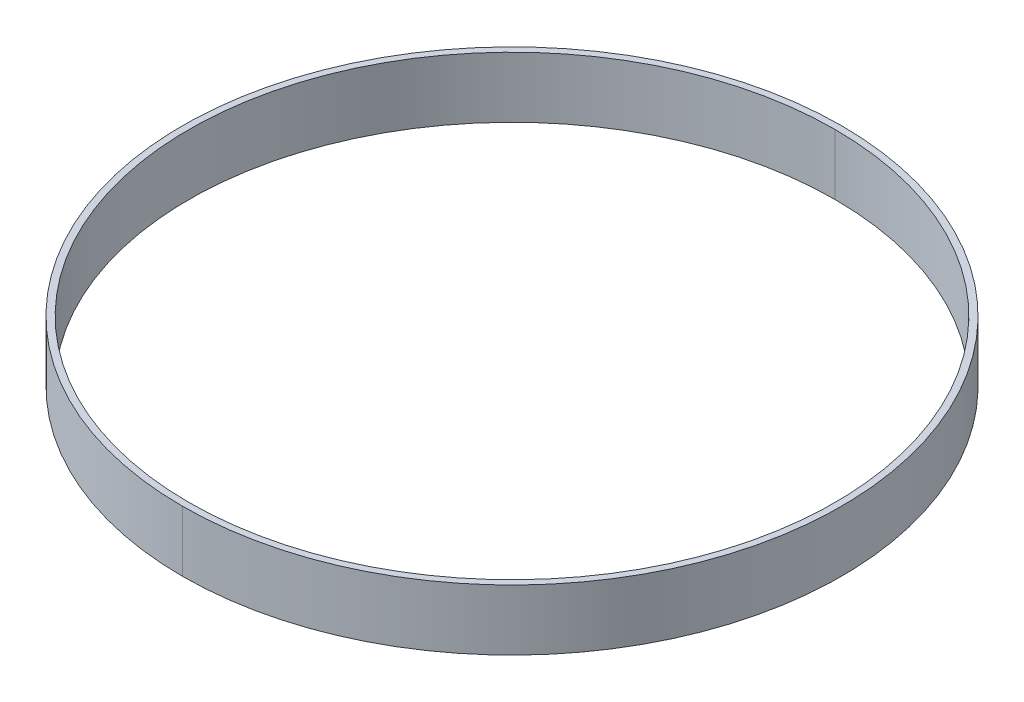
ISO-10303-21;
HEADER;
FILE_DESCRIPTION(('STEP AP214'),'2;1');
FILE_NAME('part.step','',(''),(''),'','','');
FILE_SCHEMA(('AUTOMOTIVE_DESIGN { 1 0 10303 214 1 1 1 1 }'));
ENDSEC;
DATA;
#1=APPLICATION_CONTEXT('core data for automotive mechanical design processes');
#2=APPLICATION_PROTOCOL_DEFINITION('international standard','automotive_design',2000,#1);
#3=PRODUCT_CONTEXT('',#1,'mechanical');
#4=PRODUCT('Part','Part','',(#3));
#5=PRODUCT_RELATED_PRODUCT_CATEGORY('part','',(#4));
#6=PRODUCT_DEFINITION_FORMATION('','',#4);
#7=PRODUCT_DEFINITION_CONTEXT('part definition',#1,'design');
#8=PRODUCT_DEFINITION('design','',#6,#7);
#9=PRODUCT_DEFINITION_SHAPE('','',#8);
#10=(LENGTH_UNIT() NAMED_UNIT(*) SI_UNIT(.MILLI.,.METRE.));
#11=(NAMED_UNIT(*) PLANE_ANGLE_UNIT() SI_UNIT($,.RADIAN.));
#12=(NAMED_UNIT(*) SI_UNIT($,.STERADIAN.) SOLID_ANGLE_UNIT());
#13=UNCERTAINTY_MEASURE_WITH_UNIT(LENGTH_MEASURE(1.E-05),#10,'distance_accuracy_value','');
#14=(GEOMETRIC_REPRESENTATION_CONTEXT(3) GLOBAL_UNCERTAINTY_ASSIGNED_CONTEXT((#13)) GLOBAL_UNIT_ASSIGNED_CONTEXT((#10,
#11,#12)) REPRESENTATION_CONTEXT('',''));
#15=CARTESIAN_POINT('',(0.,0.,0.));
#16=DIRECTION('',(0.,0.,1.));
#17=DIRECTION('',(1.,0.,0.));
#18=AXIS2_PLACEMENT_3D('',#15,#16,#17);
#19=CARTESIAN_POINT('',(8.77389820971411E-12,-67.5000000000016,-421.5));
#20=DIRECTION('',(0.,1.,0.));
#21=DIRECTION('',(0.,0.,1.));
#22=AXIS2_PLACEMENT_3D('',#19,#20,#21);
#23=CYLINDRICAL_SURFACE('',#22,37.25);
#24=CARTESIAN_POINT('',(8.77389820971411E-12,-67.5000000000016,-421.5));
#25=DIRECTION('',(0.,-1.,0.));
#26=DIRECTION('',(0.,0.,-1.));
#27=AXIS2_PLACEMENT_3D('',#24,#25,#26);
#28=CIRCLE('',#27,37.25);
#29=CARTESIAN_POINT('',(8.8919150771924E-12,-67.5000000000016,-384.25));
#30=VERTEX_POINT('',#29);
#31=CARTESIAN_POINT('',(8.9320592145372E-12,-67.5000000000016,-458.75));
#32=VERTEX_POINT('',#31);
#33=EDGE_CURVE('E11',#30,#32,#28,.T.);
#34=ORIENTED_EDGE('',*,*,#33,.T.);
#35=DIRECTION('',(0.,1.,0.));
#36=VECTOR('',#35,1.);
#37=CARTESIAN_POINT('',(8.79625118304992E-12,-67.5000000000016,-458.75));
#38=LINE('',#37,#36);
#39=CARTESIAN_POINT('',(8.9320592145372E-12,-60.5000000000016,-458.75));
#40=VERTEX_POINT('',#39);
#41=EDGE_CURVE('E26',#32,#40,#38,.T.);
#42=ORIENTED_EDGE('',*,*,#41,.T.);
#43=CARTESIAN_POINT('',(9.04551427268865E-12,-60.5000000000016,-421.5));
#44=DIRECTION('',(0.,-1.,0.));
#45=DIRECTION('',(0.,0.,-1.));
#46=AXIS2_PLACEMENT_3D('',#43,#44,#45);
#47=CIRCLE('',#46,37.25);
#48=CARTESIAN_POINT('',(8.8919150771924E-12,-60.5000000000016,-384.25));
#49=VERTEX_POINT('',#48);
#50=EDGE_CURVE('E48',#49,#40,#47,.T.);
#51=ORIENTED_EDGE('',*,*,#50,.F.);
#52=DIRECTION('',(0.,1.,0.));
#53=VECTOR('',#52,1.);
#54=CARTESIAN_POINT('',(8.75610704570513E-12,-67.5000000000016,-384.25));
#55=LINE('',#54,#53);
#56=EDGE_CURVE('E109',#30,#49,#55,.T.);
#57=ORIENTED_EDGE('',*,*,#56,.F.);
#58=EDGE_LOOP('',(#34,#42,#51,#57));
#59=FACE_BOUND('',#58,.T.);
#60=ADVANCED_FACE('F16',(#59),#23,.F.);
#61=CARTESIAN_POINT('',(8.77389820971411E-12,-67.5000000000016,-421.5));
#62=DIRECTION('',(0.,1.,0.));
#63=DIRECTION('',(0.,0.,1.));
#64=AXIS2_PLACEMENT_3D('',#61,#62,#63);
#65=CYLINDRICAL_SURFACE('',#64,38.);
#66=CARTESIAN_POINT('',(8.77389820971411E-12,-67.5000000000016,-421.5));
#67=DIRECTION('',(0.,-1.,0.));
#68=DIRECTION('',(0.,0.,-1.));
#69=AXIS2_PLACEMENT_3D('',#66,#67,#68);
#70=CIRCLE('',#69,38.);
#71=CARTESIAN_POINT('',(8.93250927440302E-12,-67.5000000000016,-459.5));
#72=VERTEX_POINT('',#71);
#73=CARTESIAN_POINT('',(8.89155686583652E-12,-67.5000000000016,-383.5));
#74=VERTEX_POINT('',#73);
#75=EDGE_CURVE('E76',#72,#74,#70,.T.);
#76=ORIENTED_EDGE('',*,*,#75,.F.);
#77=DIRECTION('',(0.,1.,0.));
#78=VECTOR('',#77,1.);
#79=CARTESIAN_POINT('',(8.79670124291575E-12,-67.5000000000016,-459.5));
#80=LINE('',#79,#78);
#81=CARTESIAN_POINT('',(8.93250927440302E-12,-60.5000000000016,-459.5));
#82=VERTEX_POINT('',#81);
#83=EDGE_CURVE('E80',#72,#82,#80,.T.);
#84=ORIENTED_EDGE('',*,*,#83,.T.);
#85=CARTESIAN_POINT('',(9.04551427268865E-12,-60.5000000000016,-421.5));
#86=DIRECTION('',(0.,-1.,0.));
#87=DIRECTION('',(0.,0.,-1.));
#88=AXIS2_PLACEMENT_3D('',#85,#86,#87);
#89=CIRCLE('',#88,38.);
#90=CARTESIAN_POINT('',(8.89155686583652E-12,-60.5000000000016,-383.5));
#91=VERTEX_POINT('',#90);
#92=EDGE_CURVE('E94',#82,#91,#89,.T.);
#93=ORIENTED_EDGE('',*,*,#92,.T.);
#94=DIRECTION('',(0.,1.,0.));
#95=VECTOR('',#94,1.);
#96=CARTESIAN_POINT('',(8.75574883434924E-12,-67.5000000000016,-383.5));
#97=LINE('',#96,#95);
#98=EDGE_CURVE('E82',#74,#91,#97,.T.);
#99=ORIENTED_EDGE('',*,*,#98,.F.);
#100=EDGE_LOOP('',(#76,#84,#93,#99));
#101=FACE_BOUND('',#100,.T.);
#102=ADVANCED_FACE('F78',(#101),#65,.T.);
#103=CARTESIAN_POINT('',(8.77389820971411E-12,-67.5000000000016,-421.5));
#104=DIRECTION('',(0.,-1.,0.));
#105=DIRECTION('',(-1.,0.,0.));
#106=AXIS2_PLACEMENT_3D('',#103,#104,#105);
#107=PLANE('',#106);
#108=CARTESIAN_POINT('',(8.77389820971411E-12,-67.5000000000016,-421.5));
#109=DIRECTION('',(0.,-1.,0.));
#110=DIRECTION('',(0.,0.,-1.));
#111=AXIS2_PLACEMENT_3D('',#108,#109,#110);
#112=CIRCLE('',#111,38.);
#113=EDGE_CURVE('E87',#74,#72,#112,.T.);
#114=ORIENTED_EDGE('',*,*,#113,.T.);
#115=ORIENTED_EDGE('',*,*,#75,.T.);
#116=EDGE_LOOP('',(#114,#115));
#117=FACE_BOUND('',#116,.T.);
#118=ORIENTED_EDGE('',*,*,#33,.F.);
#119=CARTESIAN_POINT('',(8.77389820971411E-12,-67.5000000000016,-421.5));
#120=DIRECTION('',(0.,-1.,0.));
#121=DIRECTION('',(0.,0.,-1.));
#122=AXIS2_PLACEMENT_3D('',#119,#120,#121);
#123=CIRCLE('',#122,37.25);
#124=EDGE_CURVE('E107',#32,#30,#123,.T.);
#125=ORIENTED_EDGE('',*,*,#124,.F.);
#126=EDGE_LOOP('',(#118,#125));
#127=FACE_BOUND('',#126,.T.);
#128=ADVANCED_FACE('F18',(#117,#127),#107,.T.);
#129=CARTESIAN_POINT('',(9.04551427268865E-12,-60.5000000000016,-421.5));
#130=DIRECTION('',(0.,-1.,0.));
#131=DIRECTION('',(-1.,0.,0.));
#132=AXIS2_PLACEMENT_3D('',#129,#130,#131);
#133=PLANE('',#132);
#134=CARTESIAN_POINT('',(9.04551427268865E-12,-60.5000000000016,-421.5));
#135=DIRECTION('',(0.,-1.,0.));
#136=DIRECTION('',(0.,0.,-1.));
#137=AXIS2_PLACEMENT_3D('',#134,#135,#136);
#138=CIRCLE('',#137,38.);
#139=EDGE_CURVE('E92',#91,#82,#138,.T.);
#140=ORIENTED_EDGE('',*,*,#139,.F.);
#141=ORIENTED_EDGE('',*,*,#92,.F.);
#142=EDGE_LOOP('',(#140,#141));
#143=FACE_BOUND('',#142,.T.);
#144=ORIENTED_EDGE('',*,*,#50,.T.);
#145=CARTESIAN_POINT('',(9.04551427268865E-12,-60.5000000000016,-421.5));
#146=DIRECTION('',(0.,-1.,0.));
#147=DIRECTION('',(0.,0.,-1.));
#148=AXIS2_PLACEMENT_3D('',#145,#146,#147);
#149=CIRCLE('',#148,37.25);
#150=EDGE_CURVE('E20',#40,#49,#149,.T.);
#151=ORIENTED_EDGE('',*,*,#150,.T.);
#152=EDGE_LOOP('',(#144,#151));
#153=FACE_BOUND('',#152,.T.);
#154=ADVANCED_FACE('F125',(#143,#153),#133,.F.);
#155=CARTESIAN_POINT('',(8.77389820971411E-12,-67.5000000000016,-421.5));
#156=DIRECTION('',(0.,1.,0.));
#157=DIRECTION('',(0.,0.,1.));
#158=AXIS2_PLACEMENT_3D('',#155,#156,#157);
#159=CYLINDRICAL_SURFACE('',#158,38.);
#160=ORIENTED_EDGE('',*,*,#83,.F.);
#161=ORIENTED_EDGE('',*,*,#113,.F.);
#162=ORIENTED_EDGE('',*,*,#98,.T.);
#163=ORIENTED_EDGE('',*,*,#139,.T.);
#164=EDGE_LOOP('',(#160,#161,#162,#163));
#165=FACE_BOUND('',#164,.T.);
#166=ADVANCED_FACE('F90',(#165),#159,.T.);
#167=CARTESIAN_POINT('',(8.77389820971411E-12,-67.5000000000016,-421.5));
#168=DIRECTION('',(0.,1.,0.));
#169=DIRECTION('',(0.,0.,1.));
#170=AXIS2_PLACEMENT_3D('',#167,#168,#169);
#171=CYLINDRICAL_SURFACE('',#170,37.25);
#172=ORIENTED_EDGE('',*,*,#41,.F.);
#173=ORIENTED_EDGE('',*,*,#124,.T.);
#174=ORIENTED_EDGE('',*,*,#56,.T.);
#175=ORIENTED_EDGE('',*,*,#150,.F.);
#176=EDGE_LOOP('',(#172,#173,#174,#175));
#177=FACE_BOUND('',#176,.T.);
#178=ADVANCED_FACE('F133',(#177),#171,.F.);
#179=CLOSED_SHELL('',(#60,#102,#128,#154,#166,#178));
#180=MANIFOLD_SOLID_BREP('B1',#179);
#181=ADVANCED_BREP_SHAPE_REPRESENTATION('',(#18,#180),#14);
#182=SHAPE_DEFINITION_REPRESENTATION(#9,#181);
ENDSEC;
END-ISO-10303-21;
